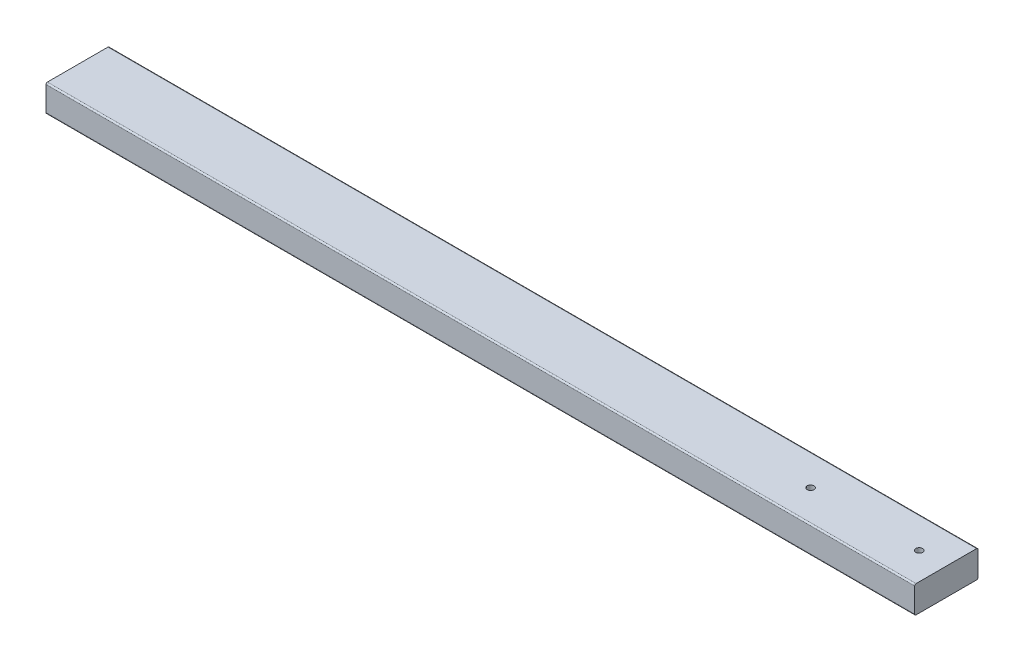
ISO-10303-21;
HEADER;
FILE_DESCRIPTION(('STEP AP214'),'2;1');
FILE_NAME('part.step','',(''),(''),'','','');
FILE_SCHEMA(('AUTOMOTIVE_DESIGN { 1 0 10303 214 1 1 1 1 }'));
ENDSEC;
DATA;
#1=APPLICATION_CONTEXT('core data for automotive mechanical design processes');
#2=APPLICATION_PROTOCOL_DEFINITION('international standard','automotive_design',2000,#1);
#3=PRODUCT_CONTEXT('',#1,'mechanical');
#4=PRODUCT('Part','Part','',(#3));
#5=PRODUCT_RELATED_PRODUCT_CATEGORY('part','',(#4));
#6=PRODUCT_DEFINITION_FORMATION('','',#4);
#7=PRODUCT_DEFINITION_CONTEXT('part definition',#1,'design');
#8=PRODUCT_DEFINITION('design','',#6,#7);
#9=PRODUCT_DEFINITION_SHAPE('','',#8);
#10=(LENGTH_UNIT() NAMED_UNIT(*) SI_UNIT(.MILLI.,.METRE.));
#11=(NAMED_UNIT(*) PLANE_ANGLE_UNIT() SI_UNIT($,.RADIAN.));
#12=(NAMED_UNIT(*) SI_UNIT($,.STERADIAN.) SOLID_ANGLE_UNIT());
#13=UNCERTAINTY_MEASURE_WITH_UNIT(LENGTH_MEASURE(1.E-05),#10,'distance_accuracy_value','');
#14=(GEOMETRIC_REPRESENTATION_CONTEXT(3) GLOBAL_UNCERTAINTY_ASSIGNED_CONTEXT((#13)) GLOBAL_UNIT_ASSIGNED_CONTEXT((#10,
#11,#12)) REPRESENTATION_CONTEXT('',''));
#15=CARTESIAN_POINT('',(0.,0.,0.));
#16=DIRECTION('',(0.,0.,1.));
#17=DIRECTION('',(1.,0.,0.));
#18=AXIS2_PLACEMENT_3D('',#15,#16,#17);
#19=CARTESIAN_POINT('',(1219.2,-19.05,-44.45));
#20=DIRECTION('',(0.,0.,1.));
#21=DIRECTION('',(1.,0.,0.));
#22=AXIS2_PLACEMENT_3D('',#19,#20,#21);
#23=PLANE('',#22);
#24=DIRECTION('',(0.,1.,0.));
#25=VECTOR('',#24,1.);
#26=CARTESIAN_POINT('',(0.,-19.05,-44.45));
#27=LINE('',#26,#25);
#28=CARTESIAN_POINT('',(0.,-17.05,-44.45));
#29=VERTEX_POINT('',#28);
#30=CARTESIAN_POINT('',(0.,17.05,-44.45));
#31=VERTEX_POINT('',#30);
#32=EDGE_CURVE('E129',#29,#31,#27,.T.);
#33=ORIENTED_EDGE('',*,*,#32,.T.);
#34=DIRECTION('',(-1.,0.,0.));
#35=VECTOR('',#34,1.);
#36=CARTESIAN_POINT('',(1219.2,17.05,-44.45));
#37=LINE('',#36,#35);
#38=CARTESIAN_POINT('',(1219.2,17.05,-44.45));
#39=VERTEX_POINT('',#38);
#40=EDGE_CURVE('E152',#31,#39,#37,.F.);
#41=ORIENTED_EDGE('',*,*,#40,.T.);
#42=DIRECTION('',(0.,1.,0.));
#43=VECTOR('',#42,1.);
#44=CARTESIAN_POINT('',(1219.2,-19.05,-44.45));
#45=LINE('',#44,#43);
#46=CARTESIAN_POINT('',(1219.2,-17.05,-44.45));
#47=VERTEX_POINT('',#46);
#48=EDGE_CURVE('E127',#47,#39,#45,.T.);
#49=ORIENTED_EDGE('',*,*,#48,.F.);
#50=DIRECTION('',(-1.,0.,0.));
#51=VECTOR('',#50,1.);
#52=CARTESIAN_POINT('',(1219.2,-17.05,-44.45));
#53=LINE('',#52,#51);
#54=EDGE_CURVE('E149',#47,#29,#53,.T.);
#55=ORIENTED_EDGE('',*,*,#54,.T.);
#56=EDGE_LOOP('',(#33,#41,#49,#55));
#57=FACE_BOUND('',#56,.T.);
#58=ADVANCED_FACE('F34',(#57),#23,.F.);
#59=CARTESIAN_POINT('',(1219.2,19.05,44.45));
#60=DIRECTION('',(0.,-1.,0.));
#61=DIRECTION('',(0.,0.,-1.));
#62=AXIS2_PLACEMENT_3D('',#59,#60,#61);
#63=PLANE('',#62);
#64=CARTESIAN_POINT('',(1181.1,19.05,0.));
#65=DIRECTION('',(0.,-1.,0.));
#66=DIRECTION('',(0.,0.,-1.));
#67=AXIS2_PLACEMENT_3D('',#64,#65,#66);
#68=CIRCLE('',#67,4.76249999999991);
#69=CARTESIAN_POINT('',(1181.1,19.05,-4.76249999999991));
#70=VERTEX_POINT('',#69);
#71=EDGE_CURVE('E182',#70,#70,#68,.T.);
#72=ORIENTED_EDGE('',*,*,#71,.T.);
#73=EDGE_LOOP('',(#72));
#74=FACE_BOUND('',#73,.T.);
#75=CARTESIAN_POINT('',(1028.7,19.05,0.));
#76=DIRECTION('',(0.,-1.,0.));
#77=DIRECTION('',(0.,0.,-1.));
#78=AXIS2_PLACEMENT_3D('',#75,#76,#77);
#79=CIRCLE('',#78,4.76249999999991);
#80=CARTESIAN_POINT('',(1028.7,19.05,-4.76249999999991));
#81=VERTEX_POINT('',#80);
#82=EDGE_CURVE('E177',#81,#81,#79,.T.);
#83=ORIENTED_EDGE('',*,*,#82,.T.);
#84=EDGE_LOOP('',(#83));
#85=FACE_BOUND('',#84,.T.);
#86=DIRECTION('',(0.,0.,1.));
#87=VECTOR('',#86,1.);
#88=CARTESIAN_POINT('',(0.,19.05,44.45));
#89=LINE('',#88,#87);
#90=CARTESIAN_POINT('',(0.,19.05,-42.45));
#91=VERTEX_POINT('',#90);
#92=CARTESIAN_POINT('',(0.,19.05,42.45));
#93=VERTEX_POINT('',#92);
#94=EDGE_CURVE('E125',#91,#93,#89,.T.);
#95=ORIENTED_EDGE('',*,*,#94,.T.);
#96=DIRECTION('',(-1.,0.,0.));
#97=VECTOR('',#96,1.);
#98=CARTESIAN_POINT('',(1219.2,19.05,42.45));
#99=LINE('',#98,#97);
#100=CARTESIAN_POINT('',(1219.2,19.05,42.45));
#101=VERTEX_POINT('',#100);
#102=EDGE_CURVE('E104',#93,#101,#99,.F.);
#103=ORIENTED_EDGE('',*,*,#102,.T.);
#104=DIRECTION('',(0.,0.,1.));
#105=VECTOR('',#104,1.);
#106=CARTESIAN_POINT('',(1219.2,19.05,44.45));
#107=LINE('',#106,#105);
#108=CARTESIAN_POINT('',(1219.2,19.05,-42.45));
#109=VERTEX_POINT('',#108);
#110=EDGE_CURVE('E168',#109,#101,#107,.T.);
#111=ORIENTED_EDGE('',*,*,#110,.F.);
#112=DIRECTION('',(-1.,0.,0.));
#113=VECTOR('',#112,1.);
#114=CARTESIAN_POINT('',(1219.2,19.05,-42.45));
#115=LINE('',#114,#113);
#116=EDGE_CURVE('E109',#109,#91,#115,.T.);
#117=ORIENTED_EDGE('',*,*,#116,.T.);
#118=EDGE_LOOP('',(#95,#103,#111,#117));
#119=FACE_BOUND('',#118,.T.);
#120=ADVANCED_FACE('F190',(#74,#85,#119),#63,.F.);
#121=CARTESIAN_POINT('',(1219.2,-19.05,44.45));
#122=DIRECTION('',(0.,0.,-1.));
#123=DIRECTION('',(-1.,0.,0.));
#124=AXIS2_PLACEMENT_3D('',#121,#122,#123);
#125=PLANE('',#124);
#126=DIRECTION('',(0.,-1.,0.));
#127=VECTOR('',#126,1.);
#128=CARTESIAN_POINT('',(1219.2,-19.05,44.45));
#129=LINE('',#128,#127);
#130=CARTESIAN_POINT('',(1219.2,17.05,44.45));
#131=VERTEX_POINT('',#130);
#132=CARTESIAN_POINT('',(1219.2,-17.05,44.45));
#133=VERTEX_POINT('',#132);
#134=EDGE_CURVE('E118',#131,#133,#129,.T.);
#135=ORIENTED_EDGE('',*,*,#134,.F.);
#136=DIRECTION('',(-1.,0.,0.));
#137=VECTOR('',#136,1.);
#138=CARTESIAN_POINT('',(1219.2,17.05,44.45));
#139=LINE('',#138,#137);
#140=CARTESIAN_POINT('',(0.,17.05,44.45));
#141=VERTEX_POINT('',#140);
#142=EDGE_CURVE('E103',#131,#141,#139,.T.);
#143=ORIENTED_EDGE('',*,*,#142,.T.);
#144=DIRECTION('',(0.,-1.,0.));
#145=VECTOR('',#144,1.);
#146=CARTESIAN_POINT('',(0.,-19.05,44.45));
#147=LINE('',#146,#145);
#148=CARTESIAN_POINT('',(0.,-17.05,44.45));
#149=VERTEX_POINT('',#148);
#150=EDGE_CURVE('E116',#141,#149,#147,.T.);
#151=ORIENTED_EDGE('',*,*,#150,.T.);
#152=DIRECTION('',(-1.,0.,0.));
#153=VECTOR('',#152,1.);
#154=CARTESIAN_POINT('',(1219.2,-17.05,44.45));
#155=LINE('',#154,#153);
#156=EDGE_CURVE('E120',#149,#133,#155,.F.);
#157=ORIENTED_EDGE('',*,*,#156,.T.);
#158=EDGE_LOOP('',(#135,#143,#151,#157));
#159=FACE_BOUND('',#158,.T.);
#160=ADVANCED_FACE('F115',(#159),#125,.F.);
#161=CARTESIAN_POINT('',(1219.2,-19.05,44.45));
#162=DIRECTION('',(0.,1.,0.));
#163=DIRECTION('',(0.,0.,1.));
#164=AXIS2_PLACEMENT_3D('',#161,#162,#163);
#165=PLANE('',#164);
#166=CARTESIAN_POINT('',(1181.1,-19.05,0.));
#167=DIRECTION('',(0.,-1.,0.));
#168=DIRECTION('',(0.,0.,-1.));
#169=AXIS2_PLACEMENT_3D('',#166,#167,#168);
#170=CIRCLE('',#169,4.76249999999991);
#171=CARTESIAN_POINT('',(1181.1,-19.05,-4.76249999999991));
#172=VERTEX_POINT('',#171);
#173=EDGE_CURVE('E184',#172,#172,#170,.T.);
#174=ORIENTED_EDGE('',*,*,#173,.F.);
#175=EDGE_LOOP('',(#174));
#176=FACE_BOUND('',#175,.T.);
#177=CARTESIAN_POINT('',(1028.7,-19.05,0.));
#178=DIRECTION('',(0.,-1.,0.));
#179=DIRECTION('',(0.,0.,-1.));
#180=AXIS2_PLACEMENT_3D('',#177,#178,#179);
#181=CIRCLE('',#180,4.76249999999991);
#182=CARTESIAN_POINT('',(1028.7,-19.05,-4.76249999999991));
#183=VERTEX_POINT('',#182);
#184=EDGE_CURVE('E173',#183,#183,#181,.T.);
#185=ORIENTED_EDGE('',*,*,#184,.F.);
#186=EDGE_LOOP('',(#185));
#187=FACE_BOUND('',#186,.T.);
#188=DIRECTION('',(0.,0.,-1.));
#189=VECTOR('',#188,1.);
#190=CARTESIAN_POINT('',(0.,-19.05,44.45));
#191=LINE('',#190,#189);
#192=CARTESIAN_POINT('',(0.,-19.05,42.45));
#193=VERTEX_POINT('',#192);
#194=CARTESIAN_POINT('',(0.,-19.05,-42.45));
#195=VERTEX_POINT('',#194);
#196=EDGE_CURVE('E124',#193,#195,#191,.T.);
#197=ORIENTED_EDGE('',*,*,#196,.T.);
#198=DIRECTION('',(-1.,0.,0.));
#199=VECTOR('',#198,1.);
#200=CARTESIAN_POINT('',(1219.2,-19.05,-42.45));
#201=LINE('',#200,#199);
#202=CARTESIAN_POINT('',(1219.2,-19.05,-42.45));
#203=VERTEX_POINT('',#202);
#204=EDGE_CURVE('E11',#195,#203,#201,.F.);
#205=ORIENTED_EDGE('',*,*,#204,.T.);
#206=DIRECTION('',(0.,0.,-1.));
#207=VECTOR('',#206,1.);
#208=CARTESIAN_POINT('',(1219.2,-19.05,44.45));
#209=LINE('',#208,#207);
#210=CARTESIAN_POINT('',(1219.2,-19.05,42.45));
#211=VERTEX_POINT('',#210);
#212=EDGE_CURVE('E133',#211,#203,#209,.T.);
#213=ORIENTED_EDGE('',*,*,#212,.F.);
#214=DIRECTION('',(-1.,0.,0.));
#215=VECTOR('',#214,1.);
#216=CARTESIAN_POINT('',(1219.2,-19.05,42.45));
#217=LINE('',#216,#215);
#218=EDGE_CURVE('E42',#211,#193,#217,.T.);
#219=ORIENTED_EDGE('',*,*,#218,.T.);
#220=EDGE_LOOP('',(#197,#205,#213,#219));
#221=FACE_BOUND('',#220,.T.);
#222=ADVANCED_FACE('F155',(#176,#187,#221),#165,.F.);
#223=CARTESIAN_POINT('',(1219.2,0.,0.));
#224=DIRECTION('',(-1.,0.,0.));
#225=DIRECTION('',(0.,0.,1.));
#226=AXIS2_PLACEMENT_3D('',#223,#224,#225);
#227=PLANE('',#226);
#228=ORIENTED_EDGE('',*,*,#110,.T.);
#229=CARTESIAN_POINT('',(1219.2,17.05,42.45));
#230=DIRECTION('',(-1.,0.,0.));
#231=DIRECTION('',(0.,0.,1.));
#232=AXIS2_PLACEMENT_3D('',#229,#230,#231);
#233=CIRCLE('',#232,2.);
#234=EDGE_CURVE('E147',#101,#131,#233,.F.);
#235=ORIENTED_EDGE('',*,*,#234,.T.);
#236=ORIENTED_EDGE('',*,*,#134,.T.);
#237=CARTESIAN_POINT('',(1219.2,-17.05,42.45));
#238=DIRECTION('',(-1.,0.,0.));
#239=DIRECTION('',(0.,0.,1.));
#240=AXIS2_PLACEMENT_3D('',#237,#238,#239);
#241=CIRCLE('',#240,2.);
#242=EDGE_CURVE('E54',#133,#211,#241,.F.);
#243=ORIENTED_EDGE('',*,*,#242,.T.);
#244=ORIENTED_EDGE('',*,*,#212,.T.);
#245=CARTESIAN_POINT('',(1219.2,-17.05,-42.45));
#246=DIRECTION('',(-1.,0.,0.));
#247=DIRECTION('',(0.,0.,1.));
#248=AXIS2_PLACEMENT_3D('',#245,#246,#247);
#249=CIRCLE('',#248,2.);
#250=EDGE_CURVE('E143',#203,#47,#249,.F.);
#251=ORIENTED_EDGE('',*,*,#250,.T.);
#252=ORIENTED_EDGE('',*,*,#48,.T.);
#253=CARTESIAN_POINT('',(1219.2,17.05,-42.45));
#254=DIRECTION('',(-1.,0.,0.));
#255=DIRECTION('',(0.,0.,1.));
#256=AXIS2_PLACEMENT_3D('',#253,#254,#255);
#257=CIRCLE('',#256,2.);
#258=EDGE_CURVE('E145',#39,#109,#257,.F.);
#259=ORIENTED_EDGE('',*,*,#258,.T.);
#260=EDGE_LOOP('',(#228,#235,#236,#243,#244,#251,#252,#259));
#261=FACE_BOUND('',#260,.T.);
#262=ADVANCED_FACE('F201',(#261),#227,.F.);
#263=CARTESIAN_POINT('',(0.,0.,0.));
#264=DIRECTION('',(-1.,0.,0.));
#265=DIRECTION('',(0.,0.,1.));
#266=AXIS2_PLACEMENT_3D('',#263,#264,#265);
#267=PLANE('',#266);
#268=ORIENTED_EDGE('',*,*,#150,.F.);
#269=CARTESIAN_POINT('',(0.,17.05,42.45));
#270=DIRECTION('',(-1.,0.,0.));
#271=DIRECTION('',(0.,0.,1.));
#272=AXIS2_PLACEMENT_3D('',#269,#270,#271);
#273=CIRCLE('',#272,2.);
#274=EDGE_CURVE('E99',#141,#93,#273,.T.);
#275=ORIENTED_EDGE('',*,*,#274,.T.);
#276=ORIENTED_EDGE('',*,*,#94,.F.);
#277=CARTESIAN_POINT('',(0.,17.05,-42.45));
#278=DIRECTION('',(-1.,0.,0.));
#279=DIRECTION('',(0.,0.,1.));
#280=AXIS2_PLACEMENT_3D('',#277,#278,#279);
#281=CIRCLE('',#280,2.);
#282=EDGE_CURVE('E110',#91,#31,#281,.T.);
#283=ORIENTED_EDGE('',*,*,#282,.T.);
#284=ORIENTED_EDGE('',*,*,#32,.F.);
#285=CARTESIAN_POINT('',(0.,-17.05,-42.45));
#286=DIRECTION('',(-1.,0.,0.));
#287=DIRECTION('',(0.,0.,1.));
#288=AXIS2_PLACEMENT_3D('',#285,#286,#287);
#289=CIRCLE('',#288,2.);
#290=EDGE_CURVE('E136',#29,#195,#289,.T.);
#291=ORIENTED_EDGE('',*,*,#290,.T.);
#292=ORIENTED_EDGE('',*,*,#196,.F.);
#293=CARTESIAN_POINT('',(0.,-17.05,42.45));
#294=DIRECTION('',(-1.,0.,0.));
#295=DIRECTION('',(0.,0.,1.));
#296=AXIS2_PLACEMENT_3D('',#293,#294,#295);
#297=CIRCLE('',#296,2.);
#298=EDGE_CURVE('E119',#193,#149,#297,.T.);
#299=ORIENTED_EDGE('',*,*,#298,.T.);
#300=EDGE_LOOP('',(#268,#275,#276,#283,#284,#291,#292,#299));
#301=FACE_BOUND('',#300,.T.);
#302=ADVANCED_FACE('F122',(#301),#267,.T.);
#303=CARTESIAN_POINT('',(1219.2,17.05,42.45));
#304=DIRECTION('',(-1.,0.,0.));
#305=DIRECTION('',(0.,0.,1.));
#306=AXIS2_PLACEMENT_3D('',#303,#304,#305);
#307=CYLINDRICAL_SURFACE('',#306,2.);
#308=ORIENTED_EDGE('',*,*,#234,.F.);
#309=ORIENTED_EDGE('',*,*,#102,.F.);
#310=ORIENTED_EDGE('',*,*,#274,.F.);
#311=ORIENTED_EDGE('',*,*,#142,.F.);
#312=EDGE_LOOP('',(#308,#309,#310,#311));
#313=FACE_BOUND('',#312,.T.);
#314=ADVANCED_FACE('F102',(#313),#307,.T.);
#315=CARTESIAN_POINT('',(1219.2,17.05,-42.45));
#316=DIRECTION('',(-1.,0.,0.));
#317=DIRECTION('',(0.,0.,1.));
#318=AXIS2_PLACEMENT_3D('',#315,#316,#317);
#319=CYLINDRICAL_SURFACE('',#318,2.);
#320=ORIENTED_EDGE('',*,*,#258,.F.);
#321=ORIENTED_EDGE('',*,*,#40,.F.);
#322=ORIENTED_EDGE('',*,*,#282,.F.);
#323=ORIENTED_EDGE('',*,*,#116,.F.);
#324=EDGE_LOOP('',(#320,#321,#322,#323));
#325=FACE_BOUND('',#324,.T.);
#326=ADVANCED_FACE('F222',(#325),#319,.T.);
#327=CARTESIAN_POINT('',(1219.2,-17.05,-42.45));
#328=DIRECTION('',(-1.,0.,0.));
#329=DIRECTION('',(0.,0.,1.));
#330=AXIS2_PLACEMENT_3D('',#327,#328,#329);
#331=CYLINDRICAL_SURFACE('',#330,2.);
#332=ORIENTED_EDGE('',*,*,#250,.F.);
#333=ORIENTED_EDGE('',*,*,#204,.F.);
#334=ORIENTED_EDGE('',*,*,#290,.F.);
#335=ORIENTED_EDGE('',*,*,#54,.F.);
#336=EDGE_LOOP('',(#332,#333,#334,#335));
#337=FACE_BOUND('',#336,.T.);
#338=ADVANCED_FACE('F162',(#337),#331,.T.);
#339=CARTESIAN_POINT('',(1219.2,-17.05,42.45));
#340=DIRECTION('',(-1.,0.,0.));
#341=DIRECTION('',(0.,0.,1.));
#342=AXIS2_PLACEMENT_3D('',#339,#340,#341);
#343=CYLINDRICAL_SURFACE('',#342,2.);
#344=ORIENTED_EDGE('',*,*,#242,.F.);
#345=ORIENTED_EDGE('',*,*,#156,.F.);
#346=ORIENTED_EDGE('',*,*,#298,.F.);
#347=ORIENTED_EDGE('',*,*,#218,.F.);
#348=EDGE_LOOP('',(#344,#345,#346,#347));
#349=FACE_BOUND('',#348,.T.);
#350=ADVANCED_FACE('F36',(#349),#343,.T.);
#351=CARTESIAN_POINT('',(1028.7,19.05,0.));
#352=DIRECTION('',(0.,-1.,0.));
#353=DIRECTION('',(0.,0.,-1.));
#354=AXIS2_PLACEMENT_3D('',#351,#352,#353);
#355=CYLINDRICAL_SURFACE('',#354,4.76249999999991);
#356=ORIENTED_EDGE('',*,*,#82,.F.);
#357=EDGE_LOOP('',(#356));
#358=FACE_BOUND('',#357,.T.);
#359=ORIENTED_EDGE('',*,*,#184,.T.);
#360=EDGE_LOOP('',(#359));
#361=FACE_BOUND('',#360,.T.);
#362=ADVANCED_FACE('F195',(#358,#361),#355,.F.);
#363=CARTESIAN_POINT('',(1181.1,19.05,0.));
#364=DIRECTION('',(0.,-1.,0.));
#365=DIRECTION('',(0.,0.,-1.));
#366=AXIS2_PLACEMENT_3D('',#363,#364,#365);
#367=CYLINDRICAL_SURFACE('',#366,4.76249999999991);
#368=ORIENTED_EDGE('',*,*,#71,.F.);
#369=EDGE_LOOP('',(#368));
#370=FACE_BOUND('',#369,.T.);
#371=ORIENTED_EDGE('',*,*,#173,.T.);
#372=EDGE_LOOP('',(#371));
#373=FACE_BOUND('',#372,.T.);
#374=ADVANCED_FACE('F192',(#370,#373),#367,.F.);
#375=CLOSED_SHELL('',(#58,#120,#160,#222,#262,#302,#314,#326,#338,#350,#362,#374));
#376=MANIFOLD_SOLID_BREP('B2',#375);
#377=ADVANCED_BREP_SHAPE_REPRESENTATION('',(#18,#376),#14);
#378=SHAPE_DEFINITION_REPRESENTATION(#9,#377);
ENDSEC;
END-ISO-10303-21;
